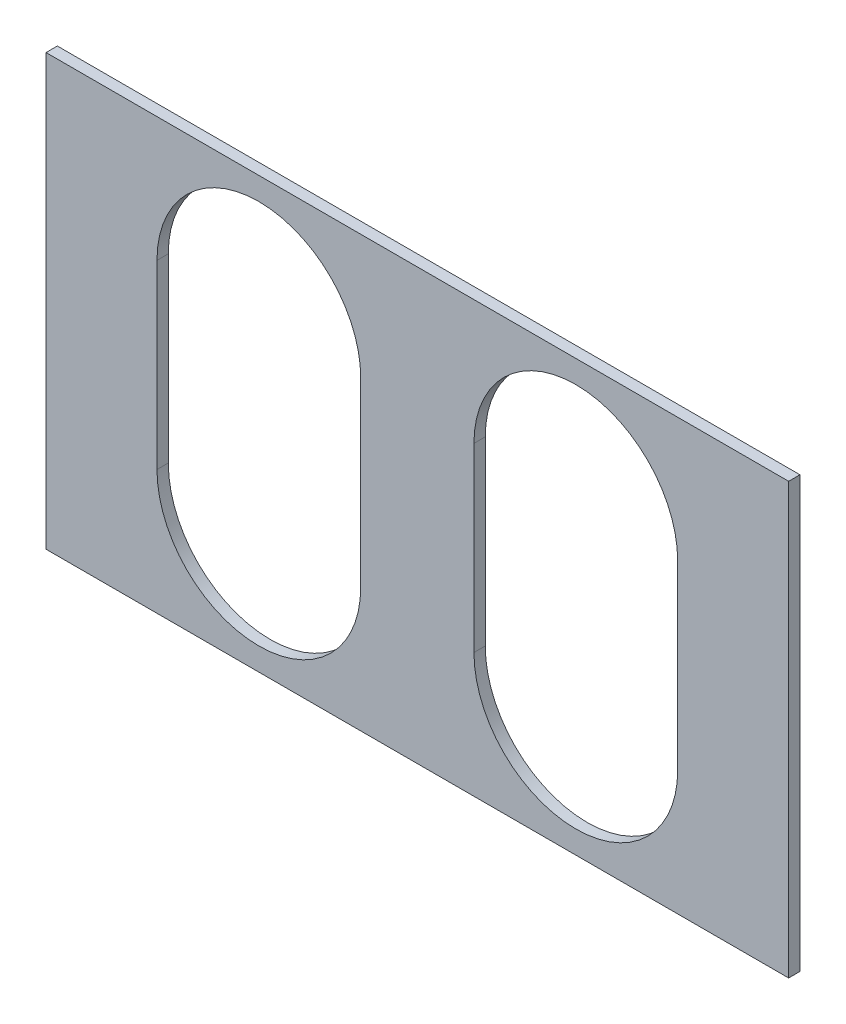
ISO-10303-21;
HEADER;
FILE_DESCRIPTION(('STEP AP214'),'2;1');
FILE_NAME('part.step','',(''),(''),'','','');
FILE_SCHEMA(('AUTOMOTIVE_DESIGN { 1 0 10303 214 1 1 1 1 }'));
ENDSEC;
DATA;
#1=APPLICATION_CONTEXT('core data for automotive mechanical design processes');
#2=APPLICATION_PROTOCOL_DEFINITION('international standard','automotive_design',2000,#1);
#3=PRODUCT_CONTEXT('',#1,'mechanical');
#4=PRODUCT('Part','Part','',(#3));
#5=PRODUCT_RELATED_PRODUCT_CATEGORY('part','',(#4));
#6=PRODUCT_DEFINITION_FORMATION('','',#4);
#7=PRODUCT_DEFINITION_CONTEXT('part definition',#1,'design');
#8=PRODUCT_DEFINITION('design','',#6,#7);
#9=PRODUCT_DEFINITION_SHAPE('','',#8);
#10=(LENGTH_UNIT() NAMED_UNIT(*) SI_UNIT(.MILLI.,.METRE.));
#11=(NAMED_UNIT(*) PLANE_ANGLE_UNIT() SI_UNIT($,.RADIAN.));
#12=(NAMED_UNIT(*) SI_UNIT($,.STERADIAN.) SOLID_ANGLE_UNIT());
#13=UNCERTAINTY_MEASURE_WITH_UNIT(LENGTH_MEASURE(1.E-05),#10,'distance_accuracy_value','');
#14=(GEOMETRIC_REPRESENTATION_CONTEXT(3) GLOBAL_UNCERTAINTY_ASSIGNED_CONTEXT((#13)) GLOBAL_UNIT_ASSIGNED_CONTEXT((#10,
#11,#12)) REPRESENTATION_CONTEXT('',''));
#15=CARTESIAN_POINT('',(0.,0.,0.));
#16=DIRECTION('',(0.,0.,1.));
#17=DIRECTION('',(1.,0.,0.));
#18=AXIS2_PLACEMENT_3D('',#15,#16,#17);
#19=CARTESIAN_POINT('',(0.,0.,5.));
#20=DIRECTION('',(0.,0.,-1.));
#21=DIRECTION('',(-1.,0.,0.));
#22=AXIS2_PLACEMENT_3D('',#19,#20,#21);
#23=PLANE('',#22);
#24=CARTESIAN_POINT('',(-70.,40.,5.));
#25=DIRECTION('',(0.,0.,1.));
#26=DIRECTION('',(1.,0.,0.));
#27=AXIS2_PLACEMENT_3D('',#24,#25,#26);
#28=CIRCLE('',#27,45.);
#29=CARTESIAN_POINT('',(-25.,40.,5.));
#30=VERTEX_POINT('',#29);
#31=CARTESIAN_POINT('',(-115.,40.,5.));
#32=VERTEX_POINT('',#31);
#33=EDGE_CURVE('E166',#30,#32,#28,.T.);
#34=ORIENTED_EDGE('',*,*,#33,.F.);
#35=DIRECTION('',(0.,1.,0.));
#36=VECTOR('',#35,1.);
#37=CARTESIAN_POINT('',(-25.,40.,5.));
#38=LINE('',#37,#36);
#39=CARTESIAN_POINT('',(-25.,-40.,5.));
#40=VERTEX_POINT('',#39);
#41=EDGE_CURVE('E174',#40,#30,#38,.T.);
#42=ORIENTED_EDGE('',*,*,#41,.F.);
#43=CARTESIAN_POINT('',(-70.,-40.,5.));
#44=DIRECTION('',(0.,0.,1.));
#45=DIRECTION('',(1.,0.,0.));
#46=AXIS2_PLACEMENT_3D('',#43,#44,#45);
#47=CIRCLE('',#46,45.);
#48=CARTESIAN_POINT('',(-115.,-40.,5.));
#49=VERTEX_POINT('',#48);
#50=EDGE_CURVE('E171',#49,#40,#47,.T.);
#51=ORIENTED_EDGE('',*,*,#50,.F.);
#52=DIRECTION('',(0.,-1.,0.));
#53=VECTOR('',#52,1.);
#54=CARTESIAN_POINT('',(-115.,40.,5.));
#55=LINE('',#54,#53);
#56=EDGE_CURVE('E168',#32,#49,#55,.T.);
#57=ORIENTED_EDGE('',*,*,#56,.F.);
#58=EDGE_LOOP('',(#34,#42,#51,#57));
#59=FACE_BOUND('',#58,.T.);
#60=DIRECTION('',(0.,-1.,0.));
#61=VECTOR('',#60,1.);
#62=CARTESIAN_POINT('',(-164.,95.,5.));
#63=LINE('',#62,#61);
#64=CARTESIAN_POINT('',(-164.,95.,5.));
#65=VERTEX_POINT('',#64);
#66=CARTESIAN_POINT('',(-164.,-95.,5.));
#67=VERTEX_POINT('',#66);
#68=EDGE_CURVE('E197',#65,#67,#63,.T.);
#69=ORIENTED_EDGE('',*,*,#68,.T.);
#70=DIRECTION('',(1.,0.,0.));
#71=VECTOR('',#70,1.);
#72=CARTESIAN_POINT('',(164.,-95.,5.));
#73=LINE('',#72,#71);
#74=CARTESIAN_POINT('',(164.,-95.,5.));
#75=VERTEX_POINT('',#74);
#76=EDGE_CURVE('E200',#67,#75,#73,.T.);
#77=ORIENTED_EDGE('',*,*,#76,.T.);
#78=DIRECTION('',(0.,1.,0.));
#79=VECTOR('',#78,1.);
#80=CARTESIAN_POINT('',(164.,95.,5.));
#81=LINE('',#80,#79);
#82=CARTESIAN_POINT('',(164.,95.,5.));
#83=VERTEX_POINT('',#82);
#84=EDGE_CURVE('E203',#75,#83,#81,.T.);
#85=ORIENTED_EDGE('',*,*,#84,.T.);
#86=DIRECTION('',(-1.,0.,0.));
#87=VECTOR('',#86,1.);
#88=CARTESIAN_POINT('',(164.,95.,5.));
#89=LINE('',#88,#87);
#90=EDGE_CURVE('E205',#83,#65,#89,.T.);
#91=ORIENTED_EDGE('',*,*,#90,.T.);
#92=EDGE_LOOP('',(#69,#77,#85,#91));
#93=FACE_BOUND('',#92,.T.);
#94=CARTESIAN_POINT('',(70.,40.,5.));
#95=DIRECTION('',(0.,0.,1.));
#96=DIRECTION('',(-1.,0.,0.));
#97=AXIS2_PLACEMENT_3D('',#94,#95,#96);
#98=CIRCLE('',#97,45.);
#99=CARTESIAN_POINT('',(115.,40.,5.));
#100=VERTEX_POINT('',#99);
#101=CARTESIAN_POINT('',(25.,40.,5.));
#102=VERTEX_POINT('',#101);
#103=EDGE_CURVE('E130',#100,#102,#98,.T.);
#104=ORIENTED_EDGE('',*,*,#103,.F.);
#105=DIRECTION('',(0.,1.,0.));
#106=VECTOR('',#105,1.);
#107=CARTESIAN_POINT('',(115.,40.,5.));
#108=LINE('',#107,#106);
#109=CARTESIAN_POINT('',(115.,-40.,5.));
#110=VERTEX_POINT('',#109);
#111=EDGE_CURVE('E152',#110,#100,#108,.T.);
#112=ORIENTED_EDGE('',*,*,#111,.F.);
#113=CARTESIAN_POINT('',(70.,-40.,5.));
#114=DIRECTION('',(0.,0.,1.));
#115=DIRECTION('',(-1.,0.,0.));
#116=AXIS2_PLACEMENT_3D('',#113,#114,#115);
#117=CIRCLE('',#116,45.);
#118=CARTESIAN_POINT('',(25.,-40.,5.));
#119=VERTEX_POINT('',#118);
#120=EDGE_CURVE('E150',#119,#110,#117,.T.);
#121=ORIENTED_EDGE('',*,*,#120,.F.);
#122=DIRECTION('',(0.,-1.,0.));
#123=VECTOR('',#122,1.);
#124=CARTESIAN_POINT('',(25.,40.,5.));
#125=LINE('',#124,#123);
#126=EDGE_CURVE('E138',#102,#119,#125,.T.);
#127=ORIENTED_EDGE('',*,*,#126,.F.);
#128=EDGE_LOOP('',(#104,#112,#121,#127));
#129=FACE_BOUND('',#128,.T.);
#130=ADVANCED_FACE('F41',(#59,#93,#129),#23,.F.);
#131=CARTESIAN_POINT('',(0.,0.,0.));
#132=DIRECTION('',(0.,0.,-1.));
#133=DIRECTION('',(-1.,0.,0.));
#134=AXIS2_PLACEMENT_3D('',#131,#132,#133);
#135=PLANE('',#134);
#136=DIRECTION('',(0.,-1.,0.));
#137=VECTOR('',#136,1.);
#138=CARTESIAN_POINT('',(-164.,95.,0.));
#139=LINE('',#138,#137);
#140=CARTESIAN_POINT('',(-164.,95.,0.));
#141=VERTEX_POINT('',#140);
#142=CARTESIAN_POINT('',(-164.,-95.,0.));
#143=VERTEX_POINT('',#142);
#144=EDGE_CURVE('E196',#141,#143,#139,.T.);
#145=ORIENTED_EDGE('',*,*,#144,.F.);
#146=DIRECTION('',(-1.,0.,0.));
#147=VECTOR('',#146,1.);
#148=CARTESIAN_POINT('',(164.,95.,0.));
#149=LINE('',#148,#147);
#150=CARTESIAN_POINT('',(164.,95.,0.));
#151=VERTEX_POINT('',#150);
#152=EDGE_CURVE('E201',#151,#141,#149,.T.);
#153=ORIENTED_EDGE('',*,*,#152,.F.);
#154=DIRECTION('',(0.,1.,0.));
#155=VECTOR('',#154,1.);
#156=CARTESIAN_POINT('',(164.,95.,0.));
#157=LINE('',#156,#155);
#158=CARTESIAN_POINT('',(164.,-95.,0.));
#159=VERTEX_POINT('',#158);
#160=EDGE_CURVE('E212',#159,#151,#157,.T.);
#161=ORIENTED_EDGE('',*,*,#160,.F.);
#162=DIRECTION('',(1.,0.,0.));
#163=VECTOR('',#162,1.);
#164=CARTESIAN_POINT('',(164.,-95.,0.));
#165=LINE('',#164,#163);
#166=EDGE_CURVE('E210',#143,#159,#165,.T.);
#167=ORIENTED_EDGE('',*,*,#166,.F.);
#168=EDGE_LOOP('',(#145,#153,#161,#167));
#169=FACE_BOUND('',#168,.T.);
#170=DIRECTION('',(0.,1.,0.));
#171=VECTOR('',#170,1.);
#172=CARTESIAN_POINT('',(-25.,40.,0.));
#173=LINE('',#172,#171);
#174=CARTESIAN_POINT('',(-25.,-40.,0.));
#175=VERTEX_POINT('',#174);
#176=CARTESIAN_POINT('',(-25.,40.,0.));
#177=VERTEX_POINT('',#176);
#178=EDGE_CURVE('E169',#175,#177,#173,.T.);
#179=ORIENTED_EDGE('',*,*,#178,.T.);
#180=CARTESIAN_POINT('',(-70.,40.,0.));
#181=DIRECTION('',(0.,0.,1.));
#182=DIRECTION('',(1.,0.,0.));
#183=AXIS2_PLACEMENT_3D('',#180,#181,#182);
#184=CIRCLE('',#183,45.);
#185=CARTESIAN_POINT('',(-115.,40.,0.));
#186=VERTEX_POINT('',#185);
#187=EDGE_CURVE('E146',#177,#186,#184,.T.);
#188=ORIENTED_EDGE('',*,*,#187,.T.);
#189=DIRECTION('',(0.,-1.,0.));
#190=VECTOR('',#189,1.);
#191=CARTESIAN_POINT('',(-115.,40.,0.));
#192=LINE('',#191,#190);
#193=CARTESIAN_POINT('',(-115.,-40.,0.));
#194=VERTEX_POINT('',#193);
#195=EDGE_CURVE('E179',#186,#194,#192,.T.);
#196=ORIENTED_EDGE('',*,*,#195,.T.);
#197=CARTESIAN_POINT('',(-70.,-40.,0.));
#198=DIRECTION('',(0.,0.,1.));
#199=DIRECTION('',(1.,0.,0.));
#200=AXIS2_PLACEMENT_3D('',#197,#198,#199);
#201=CIRCLE('',#200,45.);
#202=EDGE_CURVE('E182',#194,#175,#201,.T.);
#203=ORIENTED_EDGE('',*,*,#202,.T.);
#204=EDGE_LOOP('',(#179,#188,#196,#203));
#205=FACE_BOUND('',#204,.T.);
#206=DIRECTION('',(0.,1.,0.));
#207=VECTOR('',#206,1.);
#208=CARTESIAN_POINT('',(115.,40.,0.));
#209=LINE('',#208,#207);
#210=CARTESIAN_POINT('',(115.,-40.,0.));
#211=VERTEX_POINT('',#210);
#212=CARTESIAN_POINT('',(115.,40.,0.));
#213=VERTEX_POINT('',#212);
#214=EDGE_CURVE('E139',#211,#213,#209,.T.);
#215=ORIENTED_EDGE('',*,*,#214,.T.);
#216=CARTESIAN_POINT('',(70.,40.,0.));
#217=DIRECTION('',(0.,0.,1.));
#218=DIRECTION('',(-1.,0.,0.));
#219=AXIS2_PLACEMENT_3D('',#216,#217,#218);
#220=CIRCLE('',#219,45.);
#221=CARTESIAN_POINT('',(25.,40.,0.));
#222=VERTEX_POINT('',#221);
#223=EDGE_CURVE('E64',#213,#222,#220,.T.);
#224=ORIENTED_EDGE('',*,*,#223,.T.);
#225=DIRECTION('',(0.,-1.,0.));
#226=VECTOR('',#225,1.);
#227=CARTESIAN_POINT('',(25.,40.,0.));
#228=LINE('',#227,#226);
#229=CARTESIAN_POINT('',(25.,-40.,0.));
#230=VERTEX_POINT('',#229);
#231=EDGE_CURVE('E145',#222,#230,#228,.T.);
#232=ORIENTED_EDGE('',*,*,#231,.T.);
#233=CARTESIAN_POINT('',(70.,-40.,0.));
#234=DIRECTION('',(0.,0.,1.));
#235=DIRECTION('',(-1.,0.,0.));
#236=AXIS2_PLACEMENT_3D('',#233,#234,#235);
#237=CIRCLE('',#236,45.);
#238=EDGE_CURVE('E158',#230,#211,#237,.T.);
#239=ORIENTED_EDGE('',*,*,#238,.T.);
#240=EDGE_LOOP('',(#215,#224,#232,#239));
#241=FACE_BOUND('',#240,.T.);
#242=ADVANCED_FACE('F230',(#169,#205,#241),#135,.T.);
#243=CARTESIAN_POINT('',(-164.,95.,5.));
#244=DIRECTION('',(1.,0.,0.));
#245=DIRECTION('',(0.,1.,0.));
#246=AXIS2_PLACEMENT_3D('',#243,#244,#245);
#247=PLANE('',#246);
#248=ORIENTED_EDGE('',*,*,#144,.T.);
#249=DIRECTION('',(0.,0.,-1.));
#250=VECTOR('',#249,1.);
#251=CARTESIAN_POINT('',(-164.,-95.,5.));
#252=LINE('',#251,#250);
#253=EDGE_CURVE('E11',#67,#143,#252,.T.);
#254=ORIENTED_EDGE('',*,*,#253,.F.);
#255=ORIENTED_EDGE('',*,*,#68,.F.);
#256=DIRECTION('',(0.,0.,-1.));
#257=VECTOR('',#256,1.);
#258=CARTESIAN_POINT('',(-164.,95.,5.));
#259=LINE('',#258,#257);
#260=EDGE_CURVE('E207',#65,#141,#259,.T.);
#261=ORIENTED_EDGE('',*,*,#260,.T.);
#262=EDGE_LOOP('',(#248,#254,#255,#261));
#263=FACE_BOUND('',#262,.T.);
#264=ADVANCED_FACE('F43',(#263),#247,.F.);
#265=CARTESIAN_POINT('',(164.,-95.,5.));
#266=DIRECTION('',(0.,1.,0.));
#267=DIRECTION('',(-1.,0.,0.));
#268=AXIS2_PLACEMENT_3D('',#265,#266,#267);
#269=PLANE('',#268);
#270=ORIENTED_EDGE('',*,*,#166,.T.);
#271=DIRECTION('',(0.,0.,-1.));
#272=VECTOR('',#271,1.);
#273=CARTESIAN_POINT('',(164.,-95.,5.));
#274=LINE('',#273,#272);
#275=EDGE_CURVE('E49',#75,#159,#274,.T.);
#276=ORIENTED_EDGE('',*,*,#275,.F.);
#277=ORIENTED_EDGE('',*,*,#76,.F.);
#278=ORIENTED_EDGE('',*,*,#253,.T.);
#279=EDGE_LOOP('',(#270,#276,#277,#278));
#280=FACE_BOUND('',#279,.T.);
#281=ADVANCED_FACE('F240',(#280),#269,.F.);
#282=CARTESIAN_POINT('',(164.,95.,5.));
#283=DIRECTION('',(-1.,0.,0.));
#284=DIRECTION('',(0.,-1.,0.));
#285=AXIS2_PLACEMENT_3D('',#282,#283,#284);
#286=PLANE('',#285);
#287=ORIENTED_EDGE('',*,*,#160,.T.);
#288=DIRECTION('',(0.,0.,-1.));
#289=VECTOR('',#288,1.);
#290=CARTESIAN_POINT('',(164.,95.,5.));
#291=LINE('',#290,#289);
#292=EDGE_CURVE('E217',#83,#151,#291,.T.);
#293=ORIENTED_EDGE('',*,*,#292,.F.);
#294=ORIENTED_EDGE('',*,*,#84,.F.);
#295=ORIENTED_EDGE('',*,*,#275,.T.);
#296=EDGE_LOOP('',(#287,#293,#294,#295));
#297=FACE_BOUND('',#296,.T.);
#298=ADVANCED_FACE('F224',(#297),#286,.F.);
#299=CARTESIAN_POINT('',(164.,95.,5.));
#300=DIRECTION('',(0.,-1.,0.));
#301=DIRECTION('',(1.,0.,0.));
#302=AXIS2_PLACEMENT_3D('',#299,#300,#301);
#303=PLANE('',#302);
#304=ORIENTED_EDGE('',*,*,#152,.T.);
#305=ORIENTED_EDGE('',*,*,#260,.F.);
#306=ORIENTED_EDGE('',*,*,#90,.F.);
#307=ORIENTED_EDGE('',*,*,#292,.T.);
#308=EDGE_LOOP('',(#304,#305,#306,#307));
#309=FACE_BOUND('',#308,.T.);
#310=ADVANCED_FACE('F234',(#309),#303,.F.);
#311=CARTESIAN_POINT('',(-70.,40.,5.));
#312=DIRECTION('',(0.,0.,-1.));
#313=DIRECTION('',(-1.,0.,0.));
#314=AXIS2_PLACEMENT_3D('',#311,#312,#313);
#315=CYLINDRICAL_SURFACE('',#314,45.);
#316=ORIENTED_EDGE('',*,*,#187,.F.);
#317=DIRECTION('',(0.,0.,-1.));
#318=VECTOR('',#317,1.);
#319=CARTESIAN_POINT('',(-25.,40.,5.));
#320=LINE('',#319,#318);
#321=EDGE_CURVE('E176',#30,#177,#320,.T.);
#322=ORIENTED_EDGE('',*,*,#321,.F.);
#323=ORIENTED_EDGE('',*,*,#33,.T.);
#324=DIRECTION('',(0.,0.,-1.));
#325=VECTOR('',#324,1.);
#326=CARTESIAN_POINT('',(-115.,40.,5.));
#327=LINE('',#326,#325);
#328=EDGE_CURVE('E193',#32,#186,#327,.T.);
#329=ORIENTED_EDGE('',*,*,#328,.T.);
#330=EDGE_LOOP('',(#316,#322,#323,#329));
#331=FACE_BOUND('',#330,.T.);
#332=ADVANCED_FACE('F256',(#331),#315,.F.);
#333=CARTESIAN_POINT('',(-115.,40.,5.));
#334=DIRECTION('',(1.,0.,0.));
#335=DIRECTION('',(0.,0.,-1.));
#336=AXIS2_PLACEMENT_3D('',#333,#334,#335);
#337=PLANE('',#336);
#338=ORIENTED_EDGE('',*,*,#195,.F.);
#339=ORIENTED_EDGE('',*,*,#328,.F.);
#340=ORIENTED_EDGE('',*,*,#56,.T.);
#341=DIRECTION('',(0.,0.,-1.));
#342=VECTOR('',#341,1.);
#343=CARTESIAN_POINT('',(-115.,-40.,5.));
#344=LINE('',#343,#342);
#345=EDGE_CURVE('E191',#49,#194,#344,.T.);
#346=ORIENTED_EDGE('',*,*,#345,.T.);
#347=EDGE_LOOP('',(#338,#339,#340,#346));
#348=FACE_BOUND('',#347,.T.);
#349=ADVANCED_FACE('F263',(#348),#337,.T.);
#350=CARTESIAN_POINT('',(-70.,-40.,5.));
#351=DIRECTION('',(0.,0.,-1.));
#352=DIRECTION('',(-1.,0.,0.));
#353=AXIS2_PLACEMENT_3D('',#350,#351,#352);
#354=CYLINDRICAL_SURFACE('',#353,45.);
#355=ORIENTED_EDGE('',*,*,#202,.F.);
#356=ORIENTED_EDGE('',*,*,#345,.F.);
#357=ORIENTED_EDGE('',*,*,#50,.T.);
#358=DIRECTION('',(0.,0.,-1.));
#359=VECTOR('',#358,1.);
#360=CARTESIAN_POINT('',(-25.,-40.,5.));
#361=LINE('',#360,#359);
#362=EDGE_CURVE('E189',#40,#175,#361,.T.);
#363=ORIENTED_EDGE('',*,*,#362,.T.);
#364=EDGE_LOOP('',(#355,#356,#357,#363));
#365=FACE_BOUND('',#364,.T.);
#366=ADVANCED_FACE('F268',(#365),#354,.F.);
#367=CARTESIAN_POINT('',(-25.,40.,5.));
#368=DIRECTION('',(-1.,0.,0.));
#369=DIRECTION('',(0.,0.,1.));
#370=AXIS2_PLACEMENT_3D('',#367,#368,#369);
#371=PLANE('',#370);
#372=ORIENTED_EDGE('',*,*,#178,.F.);
#373=ORIENTED_EDGE('',*,*,#362,.F.);
#374=ORIENTED_EDGE('',*,*,#41,.T.);
#375=ORIENTED_EDGE('',*,*,#321,.T.);
#376=EDGE_LOOP('',(#372,#373,#374,#375));
#377=FACE_BOUND('',#376,.T.);
#378=ADVANCED_FACE('F274',(#377),#371,.T.);
#379=CARTESIAN_POINT('',(70.,40.,5.));
#380=DIRECTION('',(0.,0.,-1.));
#381=DIRECTION('',(-1.,0.,0.));
#382=AXIS2_PLACEMENT_3D('',#379,#380,#381);
#383=CYLINDRICAL_SURFACE('',#382,45.);
#384=ORIENTED_EDGE('',*,*,#223,.F.);
#385=DIRECTION('',(0.,0.,-1.));
#386=VECTOR('',#385,1.);
#387=CARTESIAN_POINT('',(115.,40.,5.));
#388=LINE('',#387,#386);
#389=EDGE_CURVE('E134',#100,#213,#388,.T.);
#390=ORIENTED_EDGE('',*,*,#389,.F.);
#391=ORIENTED_EDGE('',*,*,#103,.T.);
#392=DIRECTION('',(0.,0.,-1.));
#393=VECTOR('',#392,1.);
#394=CARTESIAN_POINT('',(25.,40.,5.));
#395=LINE('',#394,#393);
#396=EDGE_CURVE('E133',#102,#222,#395,.T.);
#397=ORIENTED_EDGE('',*,*,#396,.T.);
#398=EDGE_LOOP('',(#384,#390,#391,#397));
#399=FACE_BOUND('',#398,.T.);
#400=ADVANCED_FACE('F132',(#399),#383,.F.);
#401=CARTESIAN_POINT('',(25.,40.,5.));
#402=DIRECTION('',(1.,0.,0.));
#403=DIRECTION('',(0.,0.,-1.));
#404=AXIS2_PLACEMENT_3D('',#401,#402,#403);
#405=PLANE('',#404);
#406=ORIENTED_EDGE('',*,*,#231,.F.);
#407=ORIENTED_EDGE('',*,*,#396,.F.);
#408=ORIENTED_EDGE('',*,*,#126,.T.);
#409=DIRECTION('',(0.,0.,-1.));
#410=VECTOR('',#409,1.);
#411=CARTESIAN_POINT('',(25.,-40.,5.));
#412=LINE('',#411,#410);
#413=EDGE_CURVE('E147',#119,#230,#412,.T.);
#414=ORIENTED_EDGE('',*,*,#413,.T.);
#415=EDGE_LOOP('',(#406,#407,#408,#414));
#416=FACE_BOUND('',#415,.T.);
#417=ADVANCED_FACE('F142',(#416),#405,.T.);
#418=CARTESIAN_POINT('',(70.,-40.,5.));
#419=DIRECTION('',(0.,0.,-1.));
#420=DIRECTION('',(-1.,0.,0.));
#421=AXIS2_PLACEMENT_3D('',#418,#419,#420);
#422=CYLINDRICAL_SURFACE('',#421,45.);
#423=ORIENTED_EDGE('',*,*,#238,.F.);
#424=ORIENTED_EDGE('',*,*,#413,.F.);
#425=ORIENTED_EDGE('',*,*,#120,.T.);
#426=DIRECTION('',(0.,0.,-1.));
#427=VECTOR('',#426,1.);
#428=CARTESIAN_POINT('',(115.,-40.,5.));
#429=LINE('',#428,#427);
#430=EDGE_CURVE('E56',#110,#211,#429,.T.);
#431=ORIENTED_EDGE('',*,*,#430,.T.);
#432=EDGE_LOOP('',(#423,#424,#425,#431));
#433=FACE_BOUND('',#432,.T.);
#434=ADVANCED_FACE('F293',(#433),#422,.F.);
#435=CARTESIAN_POINT('',(115.,40.,5.));
#436=DIRECTION('',(-1.,0.,0.));
#437=DIRECTION('',(0.,0.,1.));
#438=AXIS2_PLACEMENT_3D('',#435,#436,#437);
#439=PLANE('',#438);
#440=ORIENTED_EDGE('',*,*,#214,.F.);
#441=ORIENTED_EDGE('',*,*,#430,.F.);
#442=ORIENTED_EDGE('',*,*,#111,.T.);
#443=ORIENTED_EDGE('',*,*,#389,.T.);
#444=EDGE_LOOP('',(#440,#441,#442,#443));
#445=FACE_BOUND('',#444,.T.);
#446=ADVANCED_FACE('F296',(#445),#439,.T.);
#447=CLOSED_SHELL('',(#130,#242,#264,#281,#298,#310,#332,#349,#366,#378,#400,#417,#434,#446));
#448=MANIFOLD_SOLID_BREP('B2',#447);
#449=ADVANCED_BREP_SHAPE_REPRESENTATION('',(#18,#448),#14);
#450=SHAPE_DEFINITION_REPRESENTATION(#9,#449);
ENDSEC;
END-ISO-10303-21;
